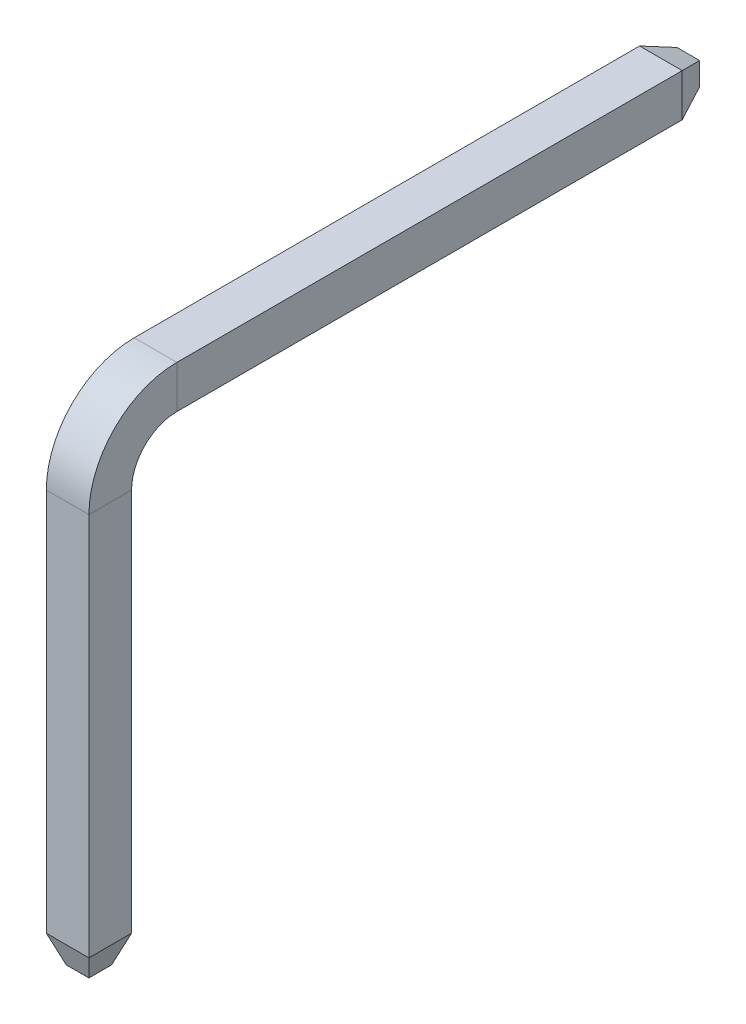
ISO-10303-21;
HEADER;
FILE_DESCRIPTION(('STEP AP214'),'2;1');
FILE_NAME('part.step','',(''),(''),'','','');
FILE_SCHEMA(('AUTOMOTIVE_DESIGN { 1 0 10303 214 1 1 1 1 }'));
ENDSEC;
DATA;
#1=APPLICATION_CONTEXT('core data for automotive mechanical design processes');
#2=APPLICATION_PROTOCOL_DEFINITION('international standard','automotive_design',2000,#1);
#3=PRODUCT_CONTEXT('',#1,'mechanical');
#4=PRODUCT('Part','Part','',(#3));
#5=PRODUCT_RELATED_PRODUCT_CATEGORY('part','',(#4));
#6=PRODUCT_DEFINITION_FORMATION('','',#4);
#7=PRODUCT_DEFINITION_CONTEXT('part definition',#1,'design');
#8=PRODUCT_DEFINITION('design','',#6,#7);
#9=PRODUCT_DEFINITION_SHAPE('','',#8);
#10=(LENGTH_UNIT() NAMED_UNIT(*) SI_UNIT(.MILLI.,.METRE.));
#11=(NAMED_UNIT(*) PLANE_ANGLE_UNIT() SI_UNIT($,.RADIAN.));
#12=(NAMED_UNIT(*) SI_UNIT($,.STERADIAN.) SOLID_ANGLE_UNIT());
#13=UNCERTAINTY_MEASURE_WITH_UNIT(LENGTH_MEASURE(1.E-05),#10,'distance_accuracy_value','');
#14=(GEOMETRIC_REPRESENTATION_CONTEXT(3) GLOBAL_UNCERTAINTY_ASSIGNED_CONTEXT((#13)) GLOBAL_UNIT_ASSIGNED_CONTEXT((#10,
#11,#12)) REPRESENTATION_CONTEXT('',''));
#15=CARTESIAN_POINT('',(0.,0.,0.));
#16=DIRECTION('',(0.,0.,1.));
#17=DIRECTION('',(1.,0.,0.));
#18=AXIS2_PLACEMENT_3D('',#15,#16,#17);
#19=CARTESIAN_POINT('',(0.,3.605,-5.55));
#20=DIRECTION('',(0.,0.939692620785813,0.342020143325932));
#21=DIRECTION('',(1.,0.,0.));
#22=AXIS2_PLACEMENT_3D('',#19,#20,#21);
#23=PLANE('',#22);
#24=DIRECTION('',(0.323615577118036,-0.323615577118036,0.889126490716097));
#25=VECTOR('',#24,1.);
#26=CARTESIAN_POINT('',(5.547540985522,3.227459014479,-4.512714667361));
#27=LINE('',#26,#25);
#28=CARTESIAN_POINT('',(5.17,3.605,-5.55));
#29=VERTEX_POINT('',#28);
#30=CARTESIAN_POINT('',(5.32,3.455,-5.137878387082));
#31=VERTEX_POINT('',#30);
#32=EDGE_CURVE('E26',#29,#31,#27,.T.);
#33=ORIENTED_EDGE('',*,*,#32,.T.);
#34=DIRECTION('',(1.,0.,0.));
#35=VECTOR('',#34,1.);
#36=CARTESIAN_POINT('',(5.32,3.455,-5.137878387082));
#37=LINE('',#36,#35);
#38=CARTESIAN_POINT('',(4.68,3.455,-5.137878387082));
#39=VERTEX_POINT('',#38);
#40=EDGE_CURVE('E19',#39,#31,#37,.T.);
#41=ORIENTED_EDGE('',*,*,#40,.F.);
#42=DIRECTION('',(0.323615577118036,0.323615577118036,-0.889126490716097));
#43=VECTOR('',#42,1.);
#44=CARTESIAN_POINT('',(4.452459014478,3.227459014479,-4.512714667361));
#45=LINE('',#44,#43);
#46=CARTESIAN_POINT('',(4.83,3.605,-5.55));
#47=VERTEX_POINT('',#46);
#48=EDGE_CURVE('E11',#39,#47,#45,.T.);
#49=ORIENTED_EDGE('',*,*,#48,.T.);
#50=DIRECTION('',(-1.,0.,0.));
#51=VECTOR('',#50,1.);
#52=CARTESIAN_POINT('',(0.,3.605,-5.55));
#53=LINE('',#52,#51);
#54=EDGE_CURVE('E256',#29,#47,#53,.T.);
#55=ORIENTED_EDGE('',*,*,#54,.F.);
#56=EDGE_LOOP('',(#33,#41,#49,#55));
#57=FACE_BOUND('',#56,.T.);
#58=ADVANCED_FACE('F16',(#57),#23,.F.);
#59=CARTESIAN_POINT('',(4.83,0.,-5.55));
#60=DIRECTION('',(0.939692620785813,0.,0.342020143325932));
#61=DIRECTION('',(0.,-1.,0.));
#62=AXIS2_PLACEMENT_3D('',#59,#60,#61);
#63=PLANE('',#62);
#64=DIRECTION('',(0.323615577118036,-0.323615577118036,-0.889126490716097));
#65=VECTOR('',#64,1.);
#66=CARTESIAN_POINT('',(5.243148179718,3.531851820282,-6.685115294663));
#67=LINE('',#66,#65);
#68=CARTESIAN_POINT('',(4.68,4.095,-5.137878387082));
#69=VERTEX_POINT('',#68);
#70=CARTESIAN_POINT('',(4.83,3.945,-5.55));
#71=VERTEX_POINT('',#70);
#72=EDGE_CURVE('E146',#69,#71,#67,.T.);
#73=ORIENTED_EDGE('',*,*,#72,.T.);
#74=DIRECTION('',(0.,1.,0.));
#75=VECTOR('',#74,1.);
#76=CARTESIAN_POINT('',(4.83,0.,-5.55));
#77=LINE('',#76,#75);
#78=EDGE_CURVE('E269',#47,#71,#77,.T.);
#79=ORIENTED_EDGE('',*,*,#78,.F.);
#80=ORIENTED_EDGE('',*,*,#48,.F.);
#81=DIRECTION('',(0.,-1.,0.));
#82=VECTOR('',#81,1.);
#83=CARTESIAN_POINT('',(4.68,3.455,-5.137878387082));
#84=LINE('',#83,#82);
#85=EDGE_CURVE('E159',#69,#39,#84,.T.);
#86=ORIENTED_EDGE('',*,*,#85,.F.);
#87=EDGE_LOOP('',(#73,#79,#80,#86));
#88=FACE_BOUND('',#87,.T.);
#89=ADVANCED_FACE('F161',(#88),#63,.F.);
#90=CARTESIAN_POINT('',(5.17,0.,-5.55));
#91=DIRECTION('',(-0.939692620785813,0.,0.342020143325932));
#92=DIRECTION('',(0.,1.,0.));
#93=AXIS2_PLACEMENT_3D('',#90,#91,#92);
#94=PLANE('',#93);
#95=DIRECTION('',(0.323615577118036,0.323615577118036,0.889126490716097));
#96=VECTOR('',#95,1.);
#97=CARTESIAN_POINT('',(4.628561194134,3.403561194134,-7.037590893133));
#98=LINE('',#97,#96);
#99=CARTESIAN_POINT('',(5.17,3.945,-5.55));
#100=VERTEX_POINT('',#99);
#101=CARTESIAN_POINT('',(5.32,4.095,-5.137878387082));
#102=VERTEX_POINT('',#101);
#103=EDGE_CURVE('E156',#100,#102,#98,.T.);
#104=ORIENTED_EDGE('',*,*,#103,.T.);
#105=DIRECTION('',(0.,1.,0.));
#106=VECTOR('',#105,1.);
#107=CARTESIAN_POINT('',(5.32,4.095,-5.137878387082));
#108=LINE('',#107,#106);
#109=EDGE_CURVE('E220',#31,#102,#108,.T.);
#110=ORIENTED_EDGE('',*,*,#109,.F.);
#111=ORIENTED_EDGE('',*,*,#32,.F.);
#112=DIRECTION('',(0.,-1.,0.));
#113=VECTOR('',#112,1.);
#114=CARTESIAN_POINT('',(5.17,0.,-5.55));
#115=LINE('',#114,#113);
#116=EDGE_CURVE('E245',#100,#29,#115,.T.);
#117=ORIENTED_EDGE('',*,*,#116,.F.);
#118=EDGE_LOOP('',(#104,#110,#111,#117));
#119=FACE_BOUND('',#118,.T.);
#120=ADVANCED_FACE('F320',(#119),#94,.F.);
#121=CARTESIAN_POINT('',(0.,3.945,-5.55));
#122=DIRECTION('',(0.,-0.939692620785813,0.342020143325932));
#123=DIRECTION('',(-1.,0.,0.));
#124=AXIS2_PLACEMENT_3D('',#121,#122,#123);
#125=PLANE('',#124);
#126=ORIENTED_EDGE('',*,*,#72,.F.);
#127=DIRECTION('',(-1.,0.,0.));
#128=VECTOR('',#127,1.);
#129=CARTESIAN_POINT('',(4.68,4.095,-5.137878387082));
#130=LINE('',#129,#128);
#131=EDGE_CURVE('E150',#102,#69,#130,.T.);
#132=ORIENTED_EDGE('',*,*,#131,.F.);
#133=ORIENTED_EDGE('',*,*,#103,.F.);
#134=DIRECTION('',(1.,0.,0.));
#135=VECTOR('',#134,1.);
#136=CARTESIAN_POINT('',(0.,3.945,-5.55));
#137=LINE('',#136,#135);
#138=EDGE_CURVE('E153',#71,#100,#137,.T.);
#139=ORIENTED_EDGE('',*,*,#138,.F.);
#140=EDGE_LOOP('',(#126,#132,#133,#139));
#141=FACE_BOUND('',#140,.T.);
#142=ADVANCED_FACE('F147',(#141),#125,.F.);
#143=CARTESIAN_POINT('',(4.68,-2.987878387082,3.77));
#144=DIRECTION('',(0.,-0.342020143325932,0.939692620785813));
#145=DIRECTION('',(-1.,0.,0.));
#146=AXIS2_PLACEMENT_3D('',#143,#144,#145);
#147=PLANE('',#146);
#148=DIRECTION('',(0.323615577118036,-0.889126490716097,-0.323615577118036));
#149=VECTOR('',#148,1.);
#150=CARTESIAN_POINT('',(4.747025306722,-3.172028903833,3.702974693278));
#151=LINE('',#150,#149);
#152=CARTESIAN_POINT('',(4.68,-2.987878387082,3.77));
#153=VERTEX_POINT('',#152);
#154=CARTESIAN_POINT('',(4.83,-3.4,3.62));
#155=VERTEX_POINT('',#154);
#156=EDGE_CURVE('E248',#153,#155,#151,.T.);
#157=ORIENTED_EDGE('',*,*,#156,.T.);
#158=DIRECTION('',(-1.,0.,0.));
#159=VECTOR('',#158,1.);
#160=CARTESIAN_POINT('',(4.68,-3.4,3.62));
#161=LINE('',#160,#159);
#162=CARTESIAN_POINT('',(5.17,-3.4,3.62));
#163=VERTEX_POINT('',#162);
#164=EDGE_CURVE('E218',#163,#155,#161,.T.);
#165=ORIENTED_EDGE('',*,*,#164,.F.);
#166=DIRECTION('',(0.323615577118036,0.889126490716097,0.323615577118036));
#167=VECTOR('',#166,1.);
#168=CARTESIAN_POINT('',(5.32,-2.987878387082,3.77));
#169=LINE('',#168,#167);
#170=CARTESIAN_POINT('',(5.32,-2.987878387082,3.77));
#171=VERTEX_POINT('',#170);
#172=EDGE_CURVE('E157',#163,#171,#169,.T.);
#173=ORIENTED_EDGE('',*,*,#172,.T.);
#174=DIRECTION('',(1.,0.,0.));
#175=VECTOR('',#174,1.);
#176=CARTESIAN_POINT('',(5.32,-2.987878387082,3.77));
#177=LINE('',#176,#175);
#178=EDGE_CURVE('E209',#153,#171,#177,.T.);
#179=ORIENTED_EDGE('',*,*,#178,.F.);
#180=EDGE_LOOP('',(#157,#165,#173,#179));
#181=FACE_BOUND('',#180,.T.);
#182=ADVANCED_FACE('F375',(#181),#147,.T.);
#183=CARTESIAN_POINT('',(5.32,-2.987878387082,3.77));
#184=DIRECTION('',(0.939692620785813,-0.342020143325932,0.));
#185=DIRECTION('',(0.,0.,-1.));
#186=AXIS2_PLACEMENT_3D('',#183,#184,#185);
#187=PLANE('',#186);
#188=DIRECTION('',(0.323615577118036,0.889126490716097,-0.323615577118036));
#189=VECTOR('',#188,1.);
#190=CARTESIAN_POINT('',(5.32,-2.987878387082,3.13));
#191=LINE('',#190,#189);
#192=CARTESIAN_POINT('',(5.17,-3.4,3.28));
#193=VERTEX_POINT('',#192);
#194=CARTESIAN_POINT('',(5.32,-2.987878387082,3.13));
#195=VERTEX_POINT('',#194);
#196=EDGE_CURVE('E200',#193,#195,#191,.T.);
#197=ORIENTED_EDGE('',*,*,#196,.T.);
#198=DIRECTION('',(0.,0.,-1.));
#199=VECTOR('',#198,1.);
#200=CARTESIAN_POINT('',(5.32,-2.987878387082,3.13));
#201=LINE('',#200,#199);
#202=EDGE_CURVE('E226',#171,#195,#201,.T.);
#203=ORIENTED_EDGE('',*,*,#202,.F.);
#204=ORIENTED_EDGE('',*,*,#172,.F.);
#205=DIRECTION('',(0.,0.,1.));
#206=VECTOR('',#205,1.);
#207=CARTESIAN_POINT('',(5.17,-3.4,3.77));
#208=LINE('',#207,#206);
#209=EDGE_CURVE('E215',#193,#163,#208,.T.);
#210=ORIENTED_EDGE('',*,*,#209,.F.);
#211=EDGE_LOOP('',(#197,#203,#204,#210));
#212=FACE_BOUND('',#211,.T.);
#213=ADVANCED_FACE('F378',(#212),#187,.T.);
#214=CARTESIAN_POINT('',(4.68,-2.987878387082,3.13));
#215=DIRECTION('',(-0.939692620785813,-0.342020143325932,0.));
#216=DIRECTION('',(-0.342020143325932,0.939692620785813,0.));
#217=AXIS2_PLACEMENT_3D('',#214,#215,#216);
#218=PLANE('',#217);
#219=DIRECTION('',(0.323615577118036,-0.889126490716097,0.323615577118036));
#220=VECTOR('',#219,1.);
#221=CARTESIAN_POINT('',(4.68,-2.987878387082,3.13));
#222=LINE('',#221,#220);
#223=CARTESIAN_POINT('',(4.68,-2.987878387082,3.13));
#224=VERTEX_POINT('',#223);
#225=CARTESIAN_POINT('',(4.83,-3.4,3.28));
#226=VERTEX_POINT('',#225);
#227=EDGE_CURVE('E40',#224,#226,#222,.T.);
#228=ORIENTED_EDGE('',*,*,#227,.T.);
#229=DIRECTION('',(0.,0.,-1.));
#230=VECTOR('',#229,1.);
#231=CARTESIAN_POINT('',(4.83,-3.4,3.13));
#232=LINE('',#231,#230);
#233=EDGE_CURVE('E201',#155,#226,#232,.T.);
#234=ORIENTED_EDGE('',*,*,#233,.F.);
#235=ORIENTED_EDGE('',*,*,#156,.F.);
#236=DIRECTION('',(0.,0.,1.));
#237=VECTOR('',#236,1.);
#238=CARTESIAN_POINT('',(4.68,-2.987878387082,3.77));
#239=LINE('',#238,#237);
#240=EDGE_CURVE('E212',#224,#153,#239,.T.);
#241=ORIENTED_EDGE('',*,*,#240,.F.);
#242=EDGE_LOOP('',(#228,#234,#235,#241));
#243=FACE_BOUND('',#242,.T.);
#244=ADVANCED_FACE('F409',(#243),#218,.T.);
#245=CARTESIAN_POINT('',(5.32,-2.987878387082,3.13));
#246=DIRECTION('',(0.,-0.342020143325932,-0.939692620785813));
#247=DIRECTION('',(0.,-0.939692620785813,0.342020143325932));
#248=AXIS2_PLACEMENT_3D('',#245,#246,#247);
#249=PLANE('',#248);
#250=ORIENTED_EDGE('',*,*,#196,.F.);
#251=DIRECTION('',(1.,0.,0.));
#252=VECTOR('',#251,1.);
#253=CARTESIAN_POINT('',(5.32,-3.4,3.28));
#254=LINE('',#253,#252);
#255=EDGE_CURVE('E197',#226,#193,#254,.T.);
#256=ORIENTED_EDGE('',*,*,#255,.F.);
#257=ORIENTED_EDGE('',*,*,#227,.F.);
#258=DIRECTION('',(-1.,0.,0.));
#259=VECTOR('',#258,1.);
#260=CARTESIAN_POINT('',(4.68,-2.987878387082,3.13));
#261=LINE('',#260,#259);
#262=EDGE_CURVE('E237',#195,#224,#261,.T.);
#263=ORIENTED_EDGE('',*,*,#262,.F.);
#264=EDGE_LOOP('',(#250,#256,#257,#263));
#265=FACE_BOUND('',#264,.T.);
#266=ADVANCED_FACE('F334',(#265),#249,.T.);
#267=CARTESIAN_POINT('',(0.,-3.4,-0.325));
#268=DIRECTION('',(0.,1.,0.));
#269=DIRECTION('',(0.,0.,-1.));
#270=AXIS2_PLACEMENT_3D('',#267,#268,#269);
#271=PLANE('',#270);
#272=ORIENTED_EDGE('',*,*,#209,.T.);
#273=ORIENTED_EDGE('',*,*,#164,.T.);
#274=ORIENTED_EDGE('',*,*,#233,.T.);
#275=ORIENTED_EDGE('',*,*,#255,.T.);
#276=EDGE_LOOP('',(#272,#273,#274,#275));
#277=FACE_BOUND('',#276,.T.);
#278=ADVANCED_FACE('F324',(#277),#271,.F.);
#279=CARTESIAN_POINT('',(0.,0.,-5.55));
#280=DIRECTION('',(0.,0.,-1.));
#281=DIRECTION('',(0.,-1.,0.));
#282=AXIS2_PLACEMENT_3D('',#279,#280,#281);
#283=PLANE('',#282);
#284=ORIENTED_EDGE('',*,*,#116,.T.);
#285=ORIENTED_EDGE('',*,*,#54,.T.);
#286=ORIENTED_EDGE('',*,*,#78,.T.);
#287=ORIENTED_EDGE('',*,*,#138,.T.);
#288=EDGE_LOOP('',(#284,#285,#286,#287));
#289=FACE_BOUND('',#288,.T.);
#290=ADVANCED_FACE('F321',(#289),#283,.T.);
#291=CARTESIAN_POINT('',(4.68,-3.4,3.13));
#292=DIRECTION('',(-1.,0.,0.));
#293=DIRECTION('',(0.,0.,1.));
#294=AXIS2_PLACEMENT_3D('',#291,#292,#293);
#295=PLANE('',#294);
#296=DIRECTION('',(0.,1.,0.));
#297=VECTOR('',#296,1.);
#298=CARTESIAN_POINT('',(4.68,-3.4,3.13));
#299=LINE('',#298,#297);
#300=CARTESIAN_POINT('',(4.68,2.775,3.13));
#301=VERTEX_POINT('',#300);
#302=EDGE_CURVE('E241',#224,#301,#299,.T.);
#303=ORIENTED_EDGE('',*,*,#302,.F.);
#304=ORIENTED_EDGE('',*,*,#240,.T.);
#305=DIRECTION('',(0.,1.,0.));
#306=VECTOR('',#305,1.);
#307=CARTESIAN_POINT('',(4.68,-3.4,3.77));
#308=LINE('',#307,#306);
#309=CARTESIAN_POINT('',(4.68,2.775,3.77));
#310=VERTEX_POINT('',#309);
#311=EDGE_CURVE('E213',#153,#310,#308,.T.);
#312=ORIENTED_EDGE('',*,*,#311,.T.);
#313=DIRECTION('',(0.,0.,1.));
#314=VECTOR('',#313,1.);
#315=CARTESIAN_POINT('',(4.68,2.775,3.13));
#316=LINE('',#315,#314);
#317=EDGE_CURVE('E195',#301,#310,#316,.T.);
#318=ORIENTED_EDGE('',*,*,#317,.F.);
#319=EDGE_LOOP('',(#303,#304,#312,#318));
#320=FACE_BOUND('',#319,.T.);
#321=ADVANCED_FACE('F323',(#320),#295,.T.);
#322=CARTESIAN_POINT('',(4.68,-3.4,3.77));
#323=DIRECTION('',(0.,0.,1.));
#324=DIRECTION('',(0.,-1.,0.));
#325=AXIS2_PLACEMENT_3D('',#322,#323,#324);
#326=PLANE('',#325);
#327=ORIENTED_EDGE('',*,*,#311,.F.);
#328=ORIENTED_EDGE('',*,*,#178,.T.);
#329=DIRECTION('',(0.,1.,0.));
#330=VECTOR('',#329,1.);
#331=CARTESIAN_POINT('',(5.32,-3.4,3.77));
#332=LINE('',#331,#330);
#333=CARTESIAN_POINT('',(5.32,2.775,3.77));
#334=VERTEX_POINT('',#333);
#335=EDGE_CURVE('E252',#171,#334,#332,.T.);
#336=ORIENTED_EDGE('',*,*,#335,.T.);
#337=DIRECTION('',(1.,0.,0.));
#338=VECTOR('',#337,1.);
#339=CARTESIAN_POINT('',(4.68,2.775,3.77));
#340=LINE('',#339,#338);
#341=EDGE_CURVE('E192',#310,#334,#340,.T.);
#342=ORIENTED_EDGE('',*,*,#341,.F.);
#343=EDGE_LOOP('',(#327,#328,#336,#342));
#344=FACE_BOUND('',#343,.T.);
#345=ADVANCED_FACE('F331',(#344),#326,.T.);
#346=CARTESIAN_POINT('',(5.32,-3.4,3.77));
#347=DIRECTION('',(1.,0.,0.));
#348=DIRECTION('',(0.,1.,0.));
#349=AXIS2_PLACEMENT_3D('',#346,#347,#348);
#350=PLANE('',#349);
#351=ORIENTED_EDGE('',*,*,#335,.F.);
#352=ORIENTED_EDGE('',*,*,#202,.T.);
#353=DIRECTION('',(0.,1.,0.));
#354=VECTOR('',#353,1.);
#355=CARTESIAN_POINT('',(5.32,-3.4,3.13));
#356=LINE('',#355,#354);
#357=CARTESIAN_POINT('',(5.32,2.775,3.13));
#358=VERTEX_POINT('',#357);
#359=EDGE_CURVE('E234',#195,#358,#356,.T.);
#360=ORIENTED_EDGE('',*,*,#359,.T.);
#361=DIRECTION('',(0.,0.,-1.));
#362=VECTOR('',#361,1.);
#363=CARTESIAN_POINT('',(5.32,2.775,3.77));
#364=LINE('',#363,#362);
#365=EDGE_CURVE('E205',#334,#358,#364,.T.);
#366=ORIENTED_EDGE('',*,*,#365,.F.);
#367=EDGE_LOOP('',(#351,#352,#360,#366));
#368=FACE_BOUND('',#367,.T.);
#369=ADVANCED_FACE('F369',(#368),#350,.T.);
#370=CARTESIAN_POINT('',(5.32,-3.4,3.13));
#371=DIRECTION('',(0.,0.,-1.));
#372=DIRECTION('',(0.,-1.,0.));
#373=AXIS2_PLACEMENT_3D('',#370,#371,#372);
#374=PLANE('',#373);
#375=ORIENTED_EDGE('',*,*,#359,.F.);
#376=ORIENTED_EDGE('',*,*,#262,.T.);
#377=ORIENTED_EDGE('',*,*,#302,.T.);
#378=DIRECTION('',(-1.,0.,0.));
#379=VECTOR('',#378,1.);
#380=CARTESIAN_POINT('',(5.32,2.775,3.13));
#381=LINE('',#380,#379);
#382=EDGE_CURVE('E208',#358,#301,#381,.T.);
#383=ORIENTED_EDGE('',*,*,#382,.F.);
#384=EDGE_LOOP('',(#375,#376,#377,#383));
#385=FACE_BOUND('',#384,.T.);
#386=ADVANCED_FACE('F365',(#385),#374,.T.);
#387=CARTESIAN_POINT('',(4.68,2.775,3.13));
#388=DIRECTION('',(-1.,0.,0.));
#389=DIRECTION('',(0.,0.,1.));
#390=AXIS2_PLACEMENT_3D('',#387,#388,#389);
#391=PLANE('',#390);
#392=CARTESIAN_POINT('',(4.68,2.775,2.45));
#393=DIRECTION('',(-1.,0.,0.));
#394=DIRECTION('',(0.,0.,1.));
#395=AXIS2_PLACEMENT_3D('',#392,#393,#394);
#396=CIRCLE('',#395,1.32);
#397=CARTESIAN_POINT('',(4.68,4.095,2.45));
#398=VERTEX_POINT('',#397);
#399=EDGE_CURVE('E196',#310,#398,#396,.T.);
#400=ORIENTED_EDGE('',*,*,#399,.T.);
#401=DIRECTION('',(0.,1.,0.));
#402=VECTOR('',#401,1.);
#403=CARTESIAN_POINT('',(4.68,3.455,2.45));
#404=LINE('',#403,#402);
#405=CARTESIAN_POINT('',(4.68,3.455,2.45));
#406=VERTEX_POINT('',#405);
#407=EDGE_CURVE('E166',#406,#398,#404,.T.);
#408=ORIENTED_EDGE('',*,*,#407,.F.);
#409=CARTESIAN_POINT('',(4.68,2.775,2.45));
#410=DIRECTION('',(-1.,0.,0.));
#411=DIRECTION('',(0.,0.,1.));
#412=AXIS2_PLACEMENT_3D('',#409,#410,#411);
#413=CIRCLE('',#412,0.68);
#414=EDGE_CURVE('E70',#301,#406,#413,.T.);
#415=ORIENTED_EDGE('',*,*,#414,.F.);
#416=ORIENTED_EDGE('',*,*,#317,.T.);
#417=EDGE_LOOP('',(#400,#408,#415,#416));
#418=FACE_BOUND('',#417,.T.);
#419=ADVANCED_FACE('F373',(#418),#391,.T.);
#420=CARTESIAN_POINT('',(5.,2.775,2.45));
#421=DIRECTION('',(-1.,0.,0.));
#422=DIRECTION('',(0.,0.,1.));
#423=AXIS2_PLACEMENT_3D('',#420,#421,#422);
#424=CYLINDRICAL_SURFACE('',#423,1.32);
#425=CARTESIAN_POINT('',(5.32,2.775,2.45));
#426=DIRECTION('',(-1.,0.,0.));
#427=DIRECTION('',(0.,0.,1.));
#428=AXIS2_PLACEMENT_3D('',#425,#426,#427);
#429=CIRCLE('',#428,1.32);
#430=CARTESIAN_POINT('',(5.32,4.095,2.45));
#431=VERTEX_POINT('',#430);
#432=EDGE_CURVE('E138',#334,#431,#429,.T.);
#433=ORIENTED_EDGE('',*,*,#432,.T.);
#434=DIRECTION('',(1.,0.,0.));
#435=VECTOR('',#434,1.);
#436=CARTESIAN_POINT('',(4.68,4.095,2.45));
#437=LINE('',#436,#435);
#438=EDGE_CURVE('E167',#398,#431,#437,.T.);
#439=ORIENTED_EDGE('',*,*,#438,.F.);
#440=ORIENTED_EDGE('',*,*,#399,.F.);
#441=ORIENTED_EDGE('',*,*,#341,.T.);
#442=EDGE_LOOP('',(#433,#439,#440,#441));
#443=FACE_BOUND('',#442,.T.);
#444=ADVANCED_FACE('F371',(#443),#424,.T.);
#445=CARTESIAN_POINT('',(5.32,2.775,3.77));
#446=DIRECTION('',(1.,0.,0.));
#447=DIRECTION('',(0.,1.,0.));
#448=AXIS2_PLACEMENT_3D('',#445,#446,#447);
#449=PLANE('',#448);
#450=CARTESIAN_POINT('',(5.32,2.775,2.45));
#451=DIRECTION('',(-1.,0.,0.));
#452=DIRECTION('',(0.,0.,1.));
#453=AXIS2_PLACEMENT_3D('',#450,#451,#452);
#454=CIRCLE('',#453,0.68);
#455=CARTESIAN_POINT('',(5.32,3.455,2.45));
#456=VERTEX_POINT('',#455);
#457=EDGE_CURVE('E229',#358,#456,#454,.T.);
#458=ORIENTED_EDGE('',*,*,#457,.T.);
#459=DIRECTION('',(0.,-1.,0.));
#460=VECTOR('',#459,1.);
#461=CARTESIAN_POINT('',(5.32,4.095,2.45));
#462=LINE('',#461,#460);
#463=EDGE_CURVE('E181',#431,#456,#462,.T.);
#464=ORIENTED_EDGE('',*,*,#463,.F.);
#465=ORIENTED_EDGE('',*,*,#432,.F.);
#466=ORIENTED_EDGE('',*,*,#365,.T.);
#467=EDGE_LOOP('',(#458,#464,#465,#466));
#468=FACE_BOUND('',#467,.T.);
#469=ADVANCED_FACE('F352',(#468),#449,.T.);
#470=CARTESIAN_POINT('',(5.,2.775,2.45));
#471=DIRECTION('',(-1.,0.,0.));
#472=DIRECTION('',(0.,0.,1.));
#473=AXIS2_PLACEMENT_3D('',#470,#471,#472);
#474=CYLINDRICAL_SURFACE('',#473,0.68);
#475=DIRECTION('',(-1.,0.,0.));
#476=VECTOR('',#475,1.);
#477=CARTESIAN_POINT('',(5.32,3.455,2.45));
#478=LINE('',#477,#476);
#479=EDGE_CURVE('E223',#456,#406,#478,.T.);
#480=ORIENTED_EDGE('',*,*,#479,.F.);
#481=ORIENTED_EDGE('',*,*,#457,.F.);
#482=ORIENTED_EDGE('',*,*,#382,.T.);
#483=ORIENTED_EDGE('',*,*,#414,.T.);
#484=EDGE_LOOP('',(#480,#481,#482,#483));
#485=FACE_BOUND('',#484,.T.);
#486=ADVANCED_FACE('F349',(#485),#474,.F.);
#487=CARTESIAN_POINT('',(4.68,3.455,2.45));
#488=DIRECTION('',(-1.,0.,0.));
#489=DIRECTION('',(0.,0.,1.));
#490=AXIS2_PLACEMENT_3D('',#487,#488,#489);
#491=PLANE('',#490);
#492=DIRECTION('',(0.,0.,-1.));
#493=VECTOR('',#492,1.);
#494=CARTESIAN_POINT('',(4.68,4.095,2.45));
#495=LINE('',#494,#493);
#496=EDGE_CURVE('E171',#398,#69,#495,.T.);
#497=ORIENTED_EDGE('',*,*,#496,.T.);
#498=ORIENTED_EDGE('',*,*,#85,.T.);
#499=DIRECTION('',(0.,0.,-1.));
#500=VECTOR('',#499,1.);
#501=CARTESIAN_POINT('',(4.68,3.455,2.45));
#502=LINE('',#501,#500);
#503=EDGE_CURVE('E262',#406,#39,#502,.T.);
#504=ORIENTED_EDGE('',*,*,#503,.F.);
#505=ORIENTED_EDGE('',*,*,#407,.T.);
#506=EDGE_LOOP('',(#497,#498,#504,#505));
#507=FACE_BOUND('',#506,.T.);
#508=ADVANCED_FACE('F172',(#507),#491,.T.);
#509=CARTESIAN_POINT('',(4.68,4.095,2.45));
#510=DIRECTION('',(0.,1.,0.));
#511=DIRECTION('',(0.,0.,-1.));
#512=AXIS2_PLACEMENT_3D('',#509,#510,#511);
#513=PLANE('',#512);
#514=DIRECTION('',(0.,0.,-1.));
#515=VECTOR('',#514,1.);
#516=CARTESIAN_POINT('',(5.32,4.095,2.45));
#517=LINE('',#516,#515);
#518=EDGE_CURVE('E178',#431,#102,#517,.T.);
#519=ORIENTED_EDGE('',*,*,#518,.T.);
#520=ORIENTED_EDGE('',*,*,#131,.T.);
#521=ORIENTED_EDGE('',*,*,#496,.F.);
#522=ORIENTED_EDGE('',*,*,#438,.T.);
#523=EDGE_LOOP('',(#519,#520,#521,#522));
#524=FACE_BOUND('',#523,.T.);
#525=ADVANCED_FACE('F176',(#524),#513,.T.);
#526=CARTESIAN_POINT('',(5.32,4.095,2.45));
#527=DIRECTION('',(1.,0.,0.));
#528=DIRECTION('',(0.,1.,0.));
#529=AXIS2_PLACEMENT_3D('',#526,#527,#528);
#530=PLANE('',#529);
#531=DIRECTION('',(0.,0.,-1.));
#532=VECTOR('',#531,1.);
#533=CARTESIAN_POINT('',(5.32,3.455,2.45));
#534=LINE('',#533,#532);
#535=EDGE_CURVE('E230',#456,#31,#534,.T.);
#536=ORIENTED_EDGE('',*,*,#535,.T.);
#537=ORIENTED_EDGE('',*,*,#109,.T.);
#538=ORIENTED_EDGE('',*,*,#518,.F.);
#539=ORIENTED_EDGE('',*,*,#463,.T.);
#540=EDGE_LOOP('',(#536,#537,#538,#539));
#541=FACE_BOUND('',#540,.T.);
#542=ADVANCED_FACE('F354',(#541),#530,.T.);
#543=CARTESIAN_POINT('',(5.32,3.455,2.45));
#544=DIRECTION('',(0.,-1.,0.));
#545=DIRECTION('',(0.,0.,-1.));
#546=AXIS2_PLACEMENT_3D('',#543,#544,#545);
#547=PLANE('',#546);
#548=ORIENTED_EDGE('',*,*,#503,.T.);
#549=ORIENTED_EDGE('',*,*,#40,.T.);
#550=ORIENTED_EDGE('',*,*,#535,.F.);
#551=ORIENTED_EDGE('',*,*,#479,.T.);
#552=EDGE_LOOP('',(#548,#549,#550,#551));
#553=FACE_BOUND('',#552,.T.);
#554=ADVANCED_FACE('F347',(#553),#547,.T.);
#555=CLOSED_SHELL('',(#58,#89,#120,#142,#182,#213,#244,#266,#278,#290,#321,#345,#369,#386,#419,
#444,#469,#486,#508,#525,#542,#554));
#556=MANIFOLD_SOLID_BREP('B1',#555);
#557=ADVANCED_BREP_SHAPE_REPRESENTATION('',(#18,#556),#14);
#558=SHAPE_DEFINITION_REPRESENTATION(#9,#557);
ENDSEC;
END-ISO-10303-21;
